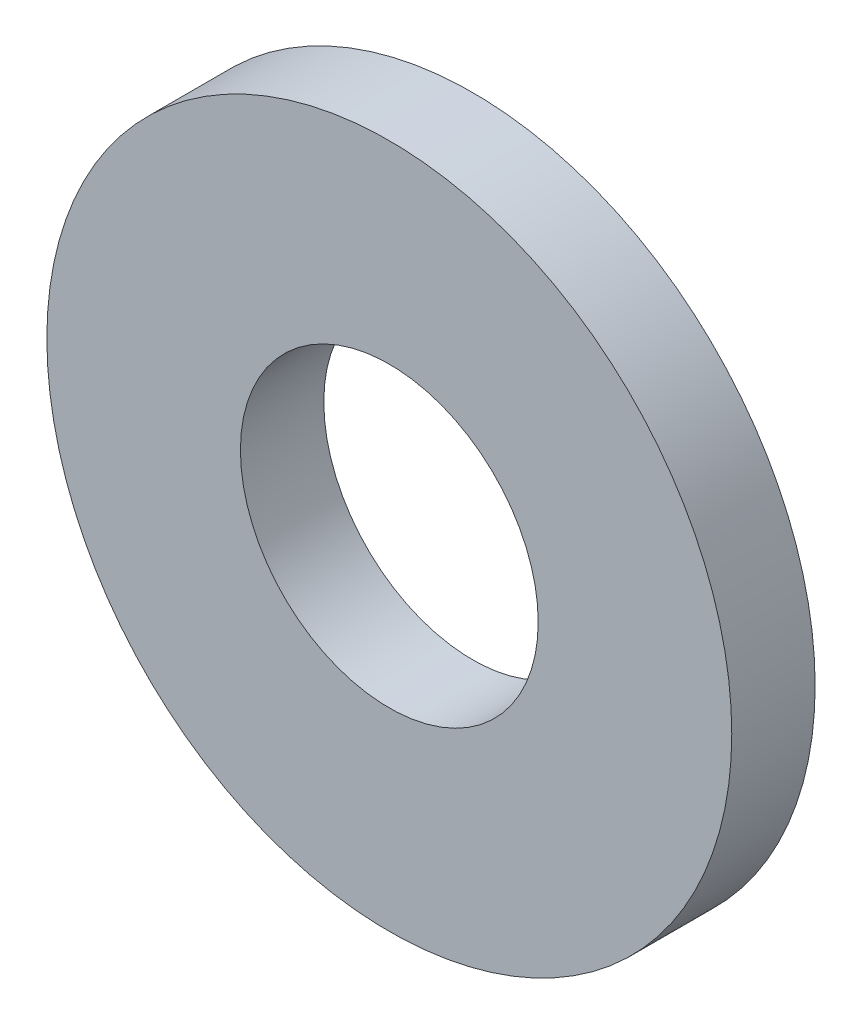
ISO-10303-21;
HEADER;
FILE_DESCRIPTION(('STEP AP214'),'2;1');
FILE_NAME('part.step','',(''),(''),'','','');
FILE_SCHEMA(('AUTOMOTIVE_DESIGN { 1 0 10303 214 1 1 1 1 }'));
ENDSEC;
DATA;
#1=APPLICATION_CONTEXT('core data for automotive mechanical design processes');
#2=APPLICATION_PROTOCOL_DEFINITION('international standard','automotive_design',2000,#1);
#3=PRODUCT_CONTEXT('',#1,'mechanical');
#4=PRODUCT('Part','Part','',(#3));
#5=PRODUCT_RELATED_PRODUCT_CATEGORY('part','',(#4));
#6=PRODUCT_DEFINITION_FORMATION('','',#4);
#7=PRODUCT_DEFINITION_CONTEXT('part definition',#1,'design');
#8=PRODUCT_DEFINITION('design','',#6,#7);
#9=PRODUCT_DEFINITION_SHAPE('','',#8);
#10=(LENGTH_UNIT() NAMED_UNIT(*) SI_UNIT(.MILLI.,.METRE.));
#11=(NAMED_UNIT(*) PLANE_ANGLE_UNIT() SI_UNIT($,.RADIAN.));
#12=(NAMED_UNIT(*) SI_UNIT($,.STERADIAN.) SOLID_ANGLE_UNIT());
#13=UNCERTAINTY_MEASURE_WITH_UNIT(LENGTH_MEASURE(1.E-05),#10,'distance_accuracy_value','');
#14=(GEOMETRIC_REPRESENTATION_CONTEXT(3) GLOBAL_UNCERTAINTY_ASSIGNED_CONTEXT((#13)) GLOBAL_UNIT_ASSIGNED_CONTEXT((#10,
#11,#12)) REPRESENTATION_CONTEXT('',''));
#15=CARTESIAN_POINT('',(0.,0.,0.));
#16=DIRECTION('',(0.,0.,1.));
#17=DIRECTION('',(1.,0.,0.));
#18=AXIS2_PLACEMENT_3D('',#15,#16,#17);
#19=CARTESIAN_POINT('',(0.,0.,0.7));
#20=DIRECTION('',(0.,0.,1.));
#21=DIRECTION('',(1.,0.,0.));
#22=AXIS2_PLACEMENT_3D('',#19,#20,#21);
#23=PLANE('',#22);
#24=CARTESIAN_POINT('',(0.,0.,0.7));
#25=DIRECTION('',(0.,0.,1.));
#26=DIRECTION('',(1.,0.,0.));
#27=AXIS2_PLACEMENT_3D('',#24,#25,#26);
#28=CIRCLE('',#27,2.875);
#29=CARTESIAN_POINT('',(2.875,0.,0.7));
#30=VERTEX_POINT('',#29);
#31=EDGE_CURVE('E10',#30,#30,#28,.T.);
#32=ORIENTED_EDGE('',*,*,#31,.T.);
#33=EDGE_LOOP('',(#32));
#34=FACE_BOUND('',#33,.T.);
#35=CARTESIAN_POINT('',(0.,0.,0.7));
#36=DIRECTION('',(0.,0.,1.));
#37=DIRECTION('',(1.,0.,0.));
#38=AXIS2_PLACEMENT_3D('',#35,#36,#37);
#39=CIRCLE('',#38,1.25);
#40=CARTESIAN_POINT('',(1.25,0.,0.7));
#41=VERTEX_POINT('',#40);
#42=EDGE_CURVE('E42',#41,#41,#39,.T.);
#43=ORIENTED_EDGE('',*,*,#42,.F.);
#44=EDGE_LOOP('',(#43));
#45=FACE_BOUND('',#44,.T.);
#46=ADVANCED_FACE('F31',(#34,#45),#23,.T.);
#47=CARTESIAN_POINT('',(0.,0.,0.));
#48=DIRECTION('',(0.,0.,1.));
#49=DIRECTION('',(1.,0.,0.));
#50=AXIS2_PLACEMENT_3D('',#47,#48,#49);
#51=PLANE('',#50);
#52=CARTESIAN_POINT('',(0.,0.,0.));
#53=DIRECTION('',(0.,0.,1.));
#54=DIRECTION('',(1.,0.,0.));
#55=AXIS2_PLACEMENT_3D('',#52,#53,#54);
#56=CIRCLE('',#55,2.875);
#57=CARTESIAN_POINT('',(2.875,0.,0.));
#58=VERTEX_POINT('',#57);
#59=EDGE_CURVE('E35',#58,#58,#56,.T.);
#60=ORIENTED_EDGE('',*,*,#59,.F.);
#61=EDGE_LOOP('',(#60));
#62=FACE_BOUND('',#61,.T.);
#63=CARTESIAN_POINT('',(0.,0.,0.));
#64=DIRECTION('',(0.,0.,1.));
#65=DIRECTION('',(1.,0.,0.));
#66=AXIS2_PLACEMENT_3D('',#63,#64,#65);
#67=CIRCLE('',#66,1.25);
#68=CARTESIAN_POINT('',(1.25,0.,0.));
#69=VERTEX_POINT('',#68);
#70=EDGE_CURVE('E44',#69,#69,#67,.T.);
#71=ORIENTED_EDGE('',*,*,#70,.T.);
#72=EDGE_LOOP('',(#71));
#73=FACE_BOUND('',#72,.T.);
#74=ADVANCED_FACE('F54',(#62,#73),#51,.F.);
#75=CARTESIAN_POINT('',(0.,0.,0.7));
#76=DIRECTION('',(0.,0.,-1.));
#77=DIRECTION('',(-1.,0.,0.));
#78=AXIS2_PLACEMENT_3D('',#75,#76,#77);
#79=CYLINDRICAL_SURFACE('',#78,2.875);
#80=ORIENTED_EDGE('',*,*,#31,.F.);
#81=EDGE_LOOP('',(#80));
#82=FACE_BOUND('',#81,.T.);
#83=ORIENTED_EDGE('',*,*,#59,.T.);
#84=EDGE_LOOP('',(#83));
#85=FACE_BOUND('',#84,.T.);
#86=ADVANCED_FACE('F33',(#82,#85),#79,.T.);
#87=CARTESIAN_POINT('',(0.,0.,0.7));
#88=DIRECTION('',(0.,0.,-1.));
#89=DIRECTION('',(-1.,0.,0.));
#90=AXIS2_PLACEMENT_3D('',#87,#88,#89);
#91=CYLINDRICAL_SURFACE('',#90,1.25);
#92=ORIENTED_EDGE('',*,*,#42,.T.);
#93=EDGE_LOOP('',(#92));
#94=FACE_BOUND('',#93,.T.);
#95=ORIENTED_EDGE('',*,*,#70,.F.);
#96=EDGE_LOOP('',(#95));
#97=FACE_BOUND('',#96,.T.);
#98=ADVANCED_FACE('F50',(#94,#97),#91,.F.);
#99=CLOSED_SHELL('',(#46,#74,#86,#98));
#100=MANIFOLD_SOLID_BREP('B2',#99);
#101=ADVANCED_BREP_SHAPE_REPRESENTATION('',(#18,#100),#14);
#102=SHAPE_DEFINITION_REPRESENTATION(#9,#101);
ENDSEC;
END-ISO-10303-21;
